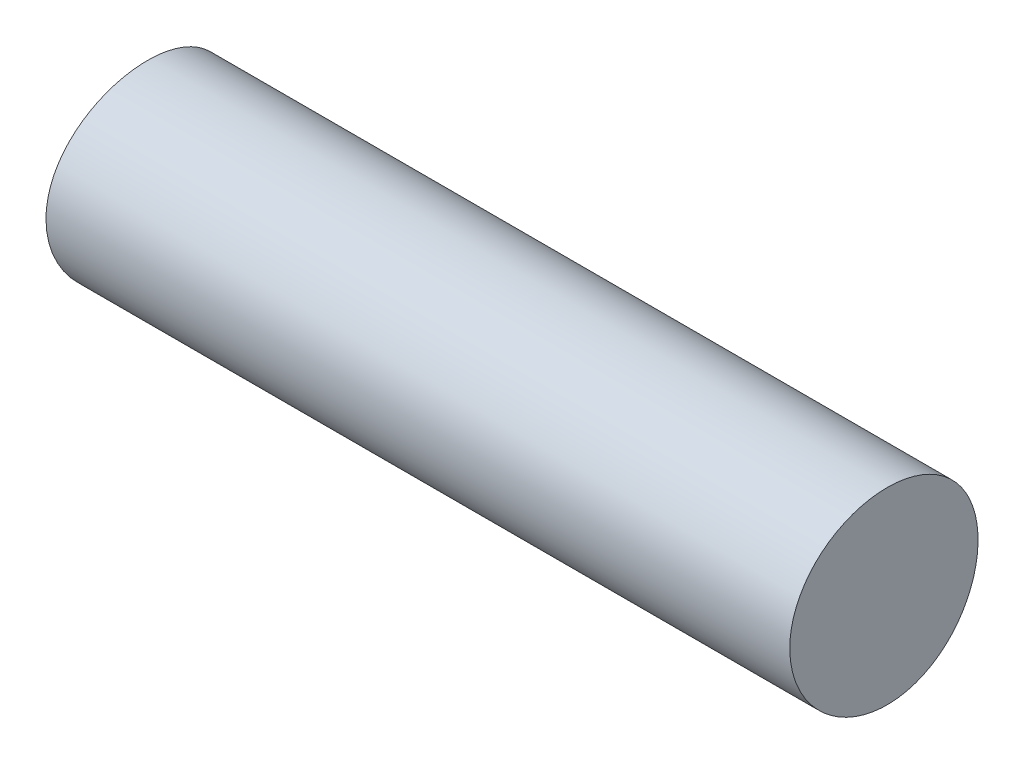
ISO-10303-21;
HEADER;
FILE_DESCRIPTION(('STEP AP214'),'2;1');
FILE_NAME('part.step','',(''),(''),'','','');
FILE_SCHEMA(('AUTOMOTIVE_DESIGN { 1 0 10303 214 1 1 1 1 }'));
ENDSEC;
DATA;
#1=APPLICATION_CONTEXT('core data for automotive mechanical design processes');
#2=APPLICATION_PROTOCOL_DEFINITION('international standard','automotive_design',2000,#1);
#3=PRODUCT_CONTEXT('',#1,'mechanical');
#4=PRODUCT('Part','Part','',(#3));
#5=PRODUCT_RELATED_PRODUCT_CATEGORY('part','',(#4));
#6=PRODUCT_DEFINITION_FORMATION('','',#4);
#7=PRODUCT_DEFINITION_CONTEXT('part definition',#1,'design');
#8=PRODUCT_DEFINITION('design','',#6,#7);
#9=PRODUCT_DEFINITION_SHAPE('','',#8);
#10=(LENGTH_UNIT() NAMED_UNIT(*) SI_UNIT(.MILLI.,.METRE.));
#11=(NAMED_UNIT(*) PLANE_ANGLE_UNIT() SI_UNIT($,.RADIAN.));
#12=(NAMED_UNIT(*) SI_UNIT($,.STERADIAN.) SOLID_ANGLE_UNIT());
#13=UNCERTAINTY_MEASURE_WITH_UNIT(LENGTH_MEASURE(1.E-05),#10,'distance_accuracy_value','');
#14=(GEOMETRIC_REPRESENTATION_CONTEXT(3) GLOBAL_UNCERTAINTY_ASSIGNED_CONTEXT((#13)) GLOBAL_UNIT_ASSIGNED_CONTEXT((#10,
#11,#12)) REPRESENTATION_CONTEXT('',''));
#15=CARTESIAN_POINT('',(0.,0.,0.));
#16=DIRECTION('',(0.,0.,1.));
#17=DIRECTION('',(1.,0.,0.));
#18=AXIS2_PLACEMENT_3D('',#15,#16,#17);
#19=CARTESIAN_POINT('',(110.,4.9046188413522,0.));
#20=DIRECTION('',(-1.,0.,0.));
#21=DIRECTION('',(0.,0.,1.));
#22=AXIS2_PLACEMENT_3D('',#19,#20,#21);
#23=CYLINDRICAL_SURFACE('',#22,3.5);
#24=CARTESIAN_POINT('',(22.2261107708929,4.9046188413522,3.5));
#25=CARTESIAN_POINT('',(22.2261141274381,4.70930261534554,3.49999199932989));
#26=CARTESIAN_POINT('',(22.2287132114458,4.51387517000979,3.48359536070723));
#27=CARTESIAN_POINT('',(22.2388209026934,4.12849046359056,3.41846300815229));
#28=CARTESIAN_POINT('',(22.2463342144307,3.93853862654167,3.3696963049871));
#29=CARTESIAN_POINT('',(22.2653992658192,3.56973894883112,3.24132348210851));
#30=CARTESIAN_POINT('',(22.2769478168358,3.39088247166664,3.16174170702204));
#31=CARTESIAN_POINT('',(22.3027783375543,3.04908466939537,2.97405620485814));
#32=CARTESIAN_POINT('',(22.3170599530873,2.88614128629079,2.86595617268124));
#33=CARTESIAN_POINT('',(22.3468847405485,2.57937016454915,2.62331013798504));
#34=CARTESIAN_POINT('',(22.3624367736815,2.43569915227219,2.4885670540169));
#35=CARTESIAN_POINT('',(22.3929711076182,2.17291024127974,2.19688547464604));
#36=CARTESIAN_POINT('',(22.4079533762861,2.05379372581951,2.03994572965387));
#37=CARTESIAN_POINT('',(22.4357531554861,1.8429135171942,1.70731791031633));
#38=CARTESIAN_POINT('',(22.4485590545345,1.75129465886886,1.53153696002179));
#39=CARTESIAN_POINT('',(22.4704649182686,1.59894041839249,1.16684873211662));
#40=CARTESIAN_POINT('',(22.4795650932445,1.53820328373685,0.977942200060337));
#41=CARTESIAN_POINT('',(22.4929716378829,1.44981310902389,0.593981035483122));
#42=CARTESIAN_POINT('',(22.4973160606297,1.42189731407736,0.398988240953517));
#43=CARTESIAN_POINT('',(22.5008521262826,1.39912599179887,0.00704109791545071));
#44=CARTESIAN_POINT('',(22.5000440761977,1.4042684946944,-0.189913133022986));
#45=CARTESIAN_POINT('',(22.4933965552525,1.4472612224457,-0.578398429706621));
#46=CARTESIAN_POINT('',(22.4876005752428,1.48482873485639,-0.769961632640022));
#47=CARTESIAN_POINT('',(22.471676886101,1.5911608579211,-1.14403161700396));
#48=CARTESIAN_POINT('',(22.4615490587275,1.65992632015314,-1.32653815107315));
#49=CARTESIAN_POINT('',(22.4380251015873,1.8269890335758,-1.67816499605679));
#50=CARTESIAN_POINT('',(22.424615931438,1.92540448668544,-1.84722823970001));
#51=CARTESIAN_POINT('',(22.3960222427278,2.14888713507169,-2.1665472496407));
#52=CARTESIAN_POINT('',(22.3808375986714,2.27395621481812,-2.31680168492121));
#53=CARTESIAN_POINT('',(22.3501953598738,2.54876859130537,-2.59590566546296));
#54=CARTESIAN_POINT('',(22.334736576738,2.69875880872793,-2.72451207619521));
#55=CARTESIAN_POINT('',(22.3054445550795,3.01831911997483,-2.95476856027025));
#56=CARTESIAN_POINT('',(22.2916113280541,3.18788935226776,-3.05641844296145));
#57=CARTESIAN_POINT('',(22.2671366787337,3.54205882128318,-3.22991404443639));
#58=CARTESIAN_POINT('',(22.2564980825166,3.72667118233815,-3.30173339552143));
#59=CARTESIAN_POINT('',(22.2396661439954,4.10554075418276,-3.41327734162307));
#60=CARTESIAN_POINT('',(22.2334724634806,4.29979722995515,-3.4530043785519));
#61=CARTESIAN_POINT('',(22.2262962033391,4.69027367144885,-3.49889967595408));
#62=CARTESIAN_POINT('',(22.2252600102673,4.88645210218682,-3.50541321697519));
#63=CARTESIAN_POINT('',(22.2283735578185,5.27709802995408,-3.48561408152108));
#64=CARTESIAN_POINT('',(22.2325231249271,5.47156558400969,-3.45930250336717));
#65=CARTESIAN_POINT('',(22.2454912996713,5.85219113168437,-3.37489336532265));
#66=CARTESIAN_POINT('',(22.2542844545574,6.03838848278778,-3.31696902609833));
#67=CARTESIAN_POINT('',(22.2755279299359,6.3984319206015,-3.17115929002653));
#68=CARTESIAN_POINT('',(22.287978443484,6.57227735470752,-3.08327231154577));
#69=CARTESIAN_POINT('',(22.3152595291601,6.9042263479239,-2.879207239903));
#70=CARTESIAN_POINT('',(22.3301085139179,7.06219140886903,-2.76280635888511));
#71=CARTESIAN_POINT('',(22.3604585024315,7.3564692559286,-2.50532611597574));
#72=CARTESIAN_POINT('',(22.3759595458903,7.49278072116036,-2.3642452496921));
#73=CARTESIAN_POINT('',(22.4060352917262,7.7411287112061,-2.05988623823672));
#74=CARTESIAN_POINT('',(22.420600411578,7.85293594495274,-1.89641991032536));
#75=CARTESIAN_POINT('',(22.4470127819162,8.04750142801586,-1.55282440307782));
#76=CARTESIAN_POINT('',(22.4588601112561,8.13026052016684,-1.37269570739343));
#77=CARTESIAN_POINT('',(22.4784601514089,8.2640171960836,-1.00159331862635));
#78=CARTESIAN_POINT('',(22.4862287819182,8.31513840854434,-0.81066506162711));
#79=CARTESIAN_POINT('',(22.4968630928652,8.38456766245549,-0.422803783043097));
#80=CARTESIAN_POINT('',(22.499729122652,8.40287804194179,-0.225871190332695));
#81=CARTESIAN_POINT('',(22.5002313450679,8.40610550663475,0.166188208897426));
#82=CARTESIAN_POINT('',(22.4979223828698,8.39137278534063,0.361312152194308));
#83=CARTESIAN_POINT('',(22.4884450879238,8.32968507845838,0.746271607267874));
#84=CARTESIAN_POINT('',(22.4812767742656,8.28273021945437,0.936107139816942));
#85=CARTESIAN_POINT('',(22.4628827065204,8.15805867561326,1.30499271033077));
#86=CARTESIAN_POINT('',(22.4516603880013,8.08036803254011,1.48405173140909));
#87=CARTESIAN_POINT('',(22.4263884871186,7.89646811480744,1.82664746653963));
#88=CARTESIAN_POINT('',(22.412338799153,7.79025777488979,1.99018360047731));
#89=CARTESIAN_POINT('',(22.3827957094145,7.55107501566762,2.29886379111357));
#90=CARTESIAN_POINT('',(22.3672892325369,7.41784468654573,2.44380677290951));
#91=CARTESIAN_POINT('',(22.3366749331415,7.12894638396332,2.70940464310382));
#92=CARTESIAN_POINT('',(22.3215672049379,6.97327315747144,2.83005382935615));
#93=CARTESIAN_POINT('',(22.2933622652195,6.64279158981056,3.04430309276387));
#94=CARTESIAN_POINT('',(22.2802778300441,6.46787270960624,3.13773433039402));
#95=CARTESIAN_POINT('',(22.2577510719313,6.10469968274206,3.29374927814051));
#96=CARTESIAN_POINT('',(22.24830501676,5.91645943705083,3.35636461748451));
#97=CARTESIAN_POINT('',(22.2362788979994,5.59027724709234,3.4349559087385));
#98=CARTESIAN_POINT('',(22.2324863811603,5.45433771654882,3.45930954507756));
#99=CARTESIAN_POINT('',(22.2274011502965,5.18049021609475,3.49183429886821));
#100=CARTESIAN_POINT('',(22.2261083999659,5.04258227480226,3.50000565134777));
#101=CARTESIAN_POINT('',(22.2261107708929,4.9046188413522,3.5));
#102=B_SPLINE_CURVE_WITH_KNOTS('',3,(#24,#25,#26,#27,#28,#29,#30,#31,#32,#33,#34,#35,#36,#37,
#38,#39,#40,#41,#42,#43,#44,#45,#46,#47,#48,#49,#50,#51,#52,#53,#54,#55,#56,#57,#58,#59,#60,#61,
#62,#63,#64,#65,#66,#67,#68,#69,#70,#71,#72,#73,#74,#75,#76,#77,#78,#79,#80,#81,#82,#83,#84,#85,
#86,#87,#88,#89,#90,#91,#92,#93,#94,#95,#96,#97,#98,#99,#100,#101),.UNSPECIFIED.,.T.,.F.,(4,2,2,
2,2,2,2,2,2,2,2,2,2,2,2,2,2,2,2,2,2,2,2,2,2,2,2,2,2,2,2,2,2,2,2,2,2,2,4),(0.,0.585444332011793,
1.17144994457482,1.75699354047962,2.3424613090399,2.93243379464048,3.52243950672744,
4.11550043787179,4.70852770968834,5.29677439130335,5.8849860226744,6.46812027914766,
7.05127045378839,7.63677687419946,8.22232470493977,8.814064103013,9.40580768608546,
9.99807321364631,10.5902936713286,11.1763447928384,11.7623763057318,12.3452284633785,
12.9281113927181,13.515702573049,14.1033295830518,14.6962402975511,15.2891338072689,
15.8796956413697,16.4702153915137,17.05450637065,17.6387950544221,18.2225897396632,
18.8064062336409,19.396082460622,19.9858969332119,20.5792958432814,21.1720844158916,
21.5856244729568,21.9991585238117),.UNSPECIFIED.);
#103=CARTESIAN_POINT('',(22.2261107708929,4.9046188413522,3.5));
#104=VERTEX_POINT('',#103);
#105=EDGE_CURVE('E10',#104,#104,#102,.T.);
#106=ORIENTED_EDGE('',*,*,#105,.T.);
#107=EDGE_LOOP('',(#106));
#108=FACE_BOUND('',#107,.T.);
#109=CARTESIAN_POINT('',(49.8773495687171,4.9046188413522,3.5));
#110=CARTESIAN_POINT('',(49.8773512044963,4.70828087424237,3.49999138017212));
#111=CARTESIAN_POINT('',(49.8785213418936,4.511806676833,3.48342363444229));
#112=CARTESIAN_POINT('',(49.8830758130885,4.12428703161688,3.41757146491605));
#113=CARTESIAN_POINT('',(49.8864627016937,3.93324811338224,3.36824929065263));
#114=CARTESIAN_POINT('',(49.8950651816424,3.56226816515465,3.23831511853374));
#115=CARTESIAN_POINT('',(49.9002797841856,3.38232119614779,3.15772003692143));
#116=CARTESIAN_POINT('',(49.9119488841528,3.0385552728105,2.96755614329887));
#117=CARTESIAN_POINT('',(49.9184031037511,2.87473271705949,2.85799382142466));
#118=CARTESIAN_POINT('',(49.9318376744177,2.56751702653042,2.61278459079358));
#119=CARTESIAN_POINT('',(49.9388188691951,2.42415776241216,2.47709528904635));
#120=CARTESIAN_POINT('',(49.9525129764347,2.16222841348439,2.18357227450859));
#121=CARTESIAN_POINT('',(49.9592258775255,2.04365937849295,2.02573762437835));
#122=CARTESIAN_POINT('',(49.9716345908384,1.83456877440213,1.69220885113593));
#123=CARTESIAN_POINT('',(49.9773293664588,1.74407572264731,1.51649680851785));
#124=CARTESIAN_POINT('',(49.9870512003765,1.59388835260109,1.15232650850269));
#125=CARTESIAN_POINT('',(49.9910782802274,1.53419363626444,0.963868415874294));
#126=CARTESIAN_POINT('',(49.9970051188361,1.44739278419931,0.579886210850923));
#127=CARTESIAN_POINT('',(49.9989083850636,1.42023291183636,0.384374300847736));
#128=CARTESIAN_POINT('',(50.0003849868549,1.39910671133283,-0.00844197006098213));
#129=CARTESIAN_POINT('',(49.9999583542714,1.4051399293996,-0.205746306424901));
#130=CARTESIAN_POINT('',(49.9968261446792,1.45018445419271,-0.596182583155041));
#131=CARTESIAN_POINT('',(49.9941245616964,1.48913796470651,-0.789321227941275));
#132=CARTESIAN_POINT('',(49.986751105506,1.59882757831614,-1.16631187270639));
#133=CARTESIAN_POINT('',(49.9820792182968,1.66956390727251,-1.35016380668012));
#134=CARTESIAN_POINT('',(49.9712841538451,1.84087632306373,-1.70354716268004));
#135=CARTESIAN_POINT('',(49.9651597085618,1.94147850133714,-1.87306589585231));
#136=CARTESIAN_POINT('',(49.9521484613148,2.16964792458415,-2.19283229585824));
#137=CARTESIAN_POINT('',(49.9452616485181,2.29721555275442,-2.34307968878479));
#138=CARTESIAN_POINT('',(49.9314829333014,2.5760208991052,-2.62037596464136));
#139=CARTESIAN_POINT('',(49.9245910516482,2.72730880047225,-2.74737439775906));
#140=CARTESIAN_POINT('',(49.9115939336943,3.04908467621664,-2.97417850420798));
#141=CARTESIAN_POINT('',(49.9054886977995,3.21957266050357,-3.07398416350428));
#142=CARTESIAN_POINT('',(49.8947545526041,3.57494234272327,-3.2435665617334));
#143=CARTESIAN_POINT('',(49.890125755705,3.75982513520149,-3.31334101452945));
#144=CARTESIAN_POINT('',(49.882870303997,4.13872087403853,-3.42084470677291));
#145=CARTESIAN_POINT('',(49.8802436195996,4.33273368542312,-3.45857441979887));
#146=CARTESIAN_POINT('',(49.8772941903426,4.72394163243987,-3.50085444037696));
#147=CARTESIAN_POINT('',(49.8769665707995,4.92112914584053,-3.50547494947156));
#148=CARTESIAN_POINT('',(49.8786394758944,5.31347623443258,-3.48158897766338));
#149=CARTESIAN_POINT('',(49.8806399852873,5.50863582289487,-3.4530827136827));
#150=CARTESIAN_POINT('',(49.8867392692123,5.89118769600139,-3.36381076757937));
#151=CARTESIAN_POINT('',(49.8908359314969,6.07858759482853,-3.30307755756909));
#152=CARTESIAN_POINT('',(49.9006641101939,6.44053579063159,-3.15110864039777));
#153=CARTESIAN_POINT('',(49.9063956451912,6.61508394148321,-3.05987258648492));
#154=CARTESIAN_POINT('',(49.9188595394281,6.9466959319827,-2.84930901636196));
#155=CARTESIAN_POINT('',(49.9255935645271,7.10372989335094,-2.72993454556145));
#156=CARTESIAN_POINT('',(49.9392978585072,7.39555458079178,-2.4665509104117));
#157=CARTESIAN_POINT('',(49.9462681302713,7.53034503530321,-2.3225414453484));
#158=CARTESIAN_POINT('',(49.959673848412,7.77409444982885,-2.01367317861251));
#159=CARTESIAN_POINT('',(49.9661083402567,7.88300792170579,-1.84877843201467));
#160=CARTESIAN_POINT('',(49.9777037623003,8.07160017925053,-1.50300056166708));
#161=CARTESIAN_POINT('',(49.9828647019664,8.15127918224265,-1.32211755678387));
#162=CARTESIAN_POINT('',(49.991327019617,8.27906190819203,-0.949663615961585));
#163=CARTESIAN_POINT('',(49.9946300799261,8.32719420349591,-0.758102522469186));
#164=CARTESIAN_POINT('',(49.9990112218645,8.39061068153531,-0.369593895439547));
#165=CARTESIAN_POINT('',(50.0000893319915,8.40589528499233,-0.172646430925024));
#166=CARTESIAN_POINT('',(49.9998991736435,8.40317819109702,0.220594730995419));
#167=CARTESIAN_POINT('',(49.9986359162003,8.38524758151274,0.416888925947945));
#168=CARTESIAN_POINT('',(49.9939149646796,8.31675672016784,0.803671738799624));
#169=CARTESIAN_POINT('',(49.9904572669893,8.26619641468555,0.994160347139893));
#170=CARTESIAN_POINT('',(49.9817358399979,8.13389816389684,1.3639332426134));
#171=CARTESIAN_POINT('',(49.9764721483082,8.05216086787229,1.54321776298884));
#172=CARTESIAN_POINT('',(49.9647290321308,7.85983794166722,1.88552933016287));
#173=CARTESIAN_POINT('',(49.958249635124,7.74925296356219,2.04855674432338));
#174=CARTESIAN_POINT('',(49.9447869306355,7.50210884023226,2.35408850759354));
#175=CARTESIAN_POINT('',(49.9378026326345,7.36549772872304,2.49655077663273));
#176=CARTESIAN_POINT('',(49.9241254921026,7.07026011081965,2.75657317372269));
#177=CARTESIAN_POINT('',(49.9174327210616,6.91162824386075,2.87412722064897));
#178=CARTESIAN_POINT('',(49.9050857417343,6.57662999548811,3.08110643312639));
#179=CARTESIAN_POINT('',(49.899433047552,6.40023832862709,3.17049072297035));
#180=CARTESIAN_POINT('',(49.8898252619714,6.0350370380219,3.31826310442802));
#181=CARTESIAN_POINT('',(49.885868195255,5.84624216083696,3.3766872818553));
#182=CARTESIAN_POINT('',(49.881130447554,5.53102428566114,3.44579537587166));
#183=CARTESIAN_POINT('',(49.8797190128627,5.40663569316448,3.46609558617902));
#184=CARTESIAN_POINT('',(49.8778280497596,5.15638968865186,3.49320065012734));
#185=CARTESIAN_POINT('',(49.877348519676,5.03053227927138,3.50000552797902));
#186=CARTESIAN_POINT('',(49.8773495687171,4.9046188413522,3.5));
#187=B_SPLINE_CURVE_WITH_KNOTS('',3,(#109,#110,#111,#112,#113,#114,#115,#116,#117,#118,#119,
#120,#121,#122,#123,#124,#125,#126,#127,#128,#129,#130,#131,#132,#133,#134,#135,#136,#137,#138,
#139,#140,#141,#142,#143,#144,#145,#146,#147,#148,#149,#150,#151,#152,#153,#154,#155,#156,#157,
#158,#159,#160,#161,#162,#163,#164,#165,#166,#167,#168,#169,#170,#171,#172,#173,#174,#175,#176,
#177,#178,#179,#180,#181,#182,#183,#184,#185,#186),.UNSPECIFIED.,.T.,.F.,(4,2,2,2,2,2,2,2,2,2,2,
2,2,2,2,2,2,2,2,2,2,2,2,2,2,2,2,2,2,2,2,2,2,2,2,2,2,2,4),(0.,0.588554216273834,1.17778793900944,
1.76670337484306,2.35548697529841,2.94523409691631,3.53500618812313,4.12537537631882,
4.71573693424673,5.30512206277371,5.89449913366063,6.48284361445073,7.07119227630192,
7.66005645219801,8.24892899680194,8.83906461661277,9.42920054100749,10.0193813817766,
10.6095535003073,11.1984739038846,11.7873904510905,12.3757147252277,12.9640456875756,
13.5533654363642,14.1426923793652,14.7330477368474,15.3233987056342,15.9132142427062,
16.5030222252272,17.0915693487741,17.6801174413102,18.2686532776044,18.8571758117363,
19.4468860017003,20.0367399987803,20.6274460037431,21.2174619836192,21.5949081740441,
21.9723536873278),.UNSPECIFIED.);
#188=CARTESIAN_POINT('',(49.8773495687171,4.9046188413522,3.5));
#189=VERTEX_POINT('',#188);
#190=EDGE_CURVE('E58',#189,#189,#187,.T.);
#191=ORIENTED_EDGE('',*,*,#190,.F.);
#192=EDGE_LOOP('',(#191));
#193=FACE_BOUND('',#192,.T.);
#194=ADVANCED_FACE('F45',(#108,#193),#23,.T.);
#195=CARTESIAN_POINT('',(0.,10.,0.));
#196=DIRECTION('',(0.,-1.,0.));
#197=DIRECTION('',(0.,0.,-1.));
#198=AXIS2_PLACEMENT_3D('',#195,#196,#197);
#199=CYLINDRICAL_SURFACE('',#198,22.5);
#200=ORIENTED_EDGE('',*,*,#105,.F.);
#201=EDGE_LOOP('',(#200));
#202=FACE_BOUND('',#201,.T.);
#203=ADVANCED_FACE('F70',(#202),#199,.F.);
#204=CARTESIAN_POINT('',(0.,10.,0.));
#205=DIRECTION('',(0.,-1.,0.));
#206=DIRECTION('',(0.,0.,-1.));
#207=AXIS2_PLACEMENT_3D('',#204,#205,#206);
#208=CYLINDRICAL_SURFACE('',#207,50.);
#209=ORIENTED_EDGE('',*,*,#190,.T.);
#210=EDGE_LOOP('',(#209));
#211=FACE_BOUND('',#210,.T.);
#212=ADVANCED_FACE('F47',(#211),#208,.T.);
#213=CLOSED_SHELL('',(#194,#203,#212));
#214=MANIFOLD_SOLID_BREP('B2',#213);
#215=ADVANCED_BREP_SHAPE_REPRESENTATION('',(#18,#214),#14);
#216=SHAPE_DEFINITION_REPRESENTATION(#9,#215);
ENDSEC;
END-ISO-10303-21;
